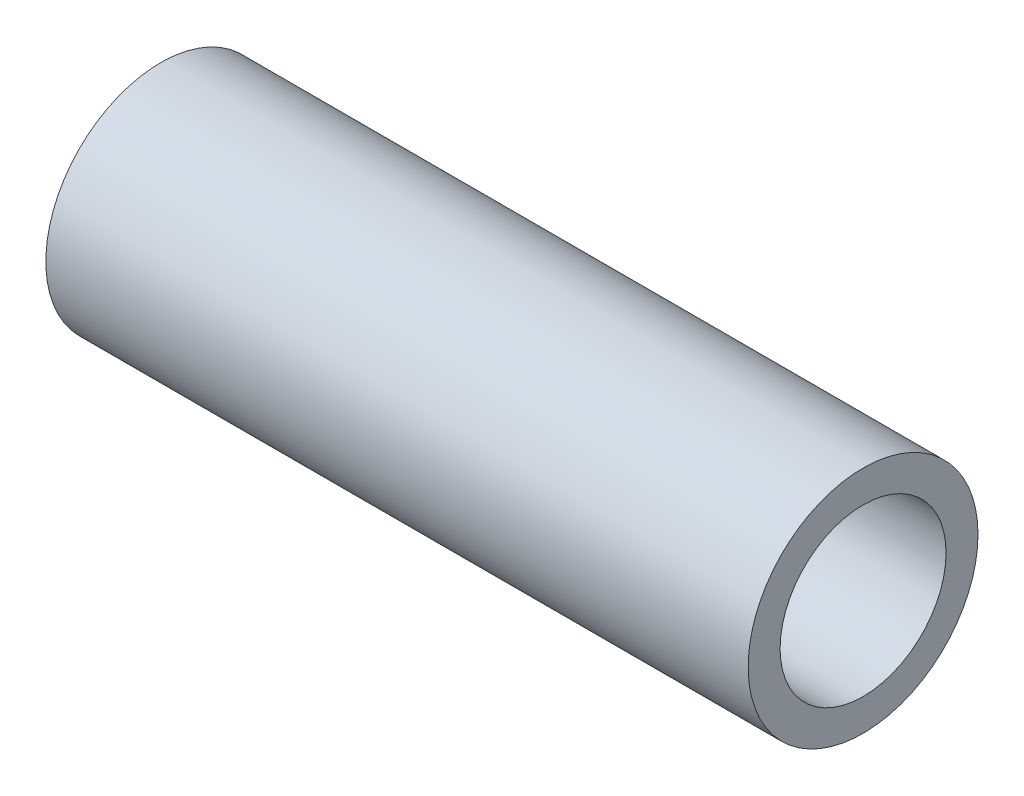
ISO-10303-21;
HEADER;
FILE_DESCRIPTION(('STEP AP214'),'2;1');
FILE_NAME('part.step','',(''),(''),'','','');
FILE_SCHEMA(('AUTOMOTIVE_DESIGN { 1 0 10303 214 1 1 1 1 }'));
ENDSEC;
DATA;
#1=APPLICATION_CONTEXT('core data for automotive mechanical design processes');
#2=APPLICATION_PROTOCOL_DEFINITION('international standard','automotive_design',2000,#1);
#3=PRODUCT_CONTEXT('',#1,'mechanical');
#4=PRODUCT('Part','Part','',(#3));
#5=PRODUCT_RELATED_PRODUCT_CATEGORY('part','',(#4));
#6=PRODUCT_DEFINITION_FORMATION('','',#4);
#7=PRODUCT_DEFINITION_CONTEXT('part definition',#1,'design');
#8=PRODUCT_DEFINITION('design','',#6,#7);
#9=PRODUCT_DEFINITION_SHAPE('','',#8);
#10=(LENGTH_UNIT() NAMED_UNIT(*) SI_UNIT(.MILLI.,.METRE.));
#11=(NAMED_UNIT(*) PLANE_ANGLE_UNIT() SI_UNIT($,.RADIAN.));
#12=(NAMED_UNIT(*) SI_UNIT($,.STERADIAN.) SOLID_ANGLE_UNIT());
#13=UNCERTAINTY_MEASURE_WITH_UNIT(LENGTH_MEASURE(1.E-05),#10,'distance_accuracy_value','');
#14=(GEOMETRIC_REPRESENTATION_CONTEXT(3) GLOBAL_UNCERTAINTY_ASSIGNED_CONTEXT((#13)) GLOBAL_UNIT_ASSIGNED_CONTEXT((#10,
#11,#12)) REPRESENTATION_CONTEXT('',''));
#15=CARTESIAN_POINT('',(0.,0.,0.));
#16=DIRECTION('',(0.,0.,1.));
#17=DIRECTION('',(1.,0.,0.));
#18=AXIS2_PLACEMENT_3D('',#15,#16,#17);
#19=CARTESIAN_POINT('',(27.5,0.,0.));
#20=DIRECTION('',(1.,0.,0.));
#21=DIRECTION('',(0.,0.,-1.));
#22=AXIS2_PLACEMENT_3D('',#19,#20,#21);
#23=PLANE('',#22);
#24=CARTESIAN_POINT('',(27.5,0.,0.));
#25=DIRECTION('',(1.,0.,0.));
#26=DIRECTION('',(0.,0.,-1.));
#27=AXIS2_PLACEMENT_3D('',#24,#25,#26);
#28=CIRCLE('',#27,9.);
#29=CARTESIAN_POINT('',(27.5,0.,-9.));
#30=VERTEX_POINT('',#29);
#31=EDGE_CURVE('E10',#30,#30,#28,.T.);
#32=ORIENTED_EDGE('',*,*,#31,.T.);
#33=EDGE_LOOP('',(#32));
#34=FACE_BOUND('',#33,.T.);
#35=CARTESIAN_POINT('',(27.5,0.,0.));
#36=DIRECTION('',(1.,0.,0.));
#37=DIRECTION('',(0.,0.,-1.));
#38=AXIS2_PLACEMENT_3D('',#35,#36,#37);
#39=CIRCLE('',#38,6.5);
#40=CARTESIAN_POINT('',(27.5,0.,-6.5));
#41=VERTEX_POINT('',#40);
#42=EDGE_CURVE('E48',#41,#41,#39,.T.);
#43=ORIENTED_EDGE('',*,*,#42,.F.);
#44=EDGE_LOOP('',(#43));
#45=FACE_BOUND('',#44,.T.);
#46=ADVANCED_FACE('F40',(#34,#45),#23,.T.);
#47=CARTESIAN_POINT('',(-27.5,0.,0.));
#48=DIRECTION('',(1.,0.,0.));
#49=DIRECTION('',(0.,0.,-1.));
#50=AXIS2_PLACEMENT_3D('',#47,#48,#49);
#51=PLANE('',#50);
#52=CARTESIAN_POINT('',(-27.5,0.,0.));
#53=DIRECTION('',(1.,0.,0.));
#54=DIRECTION('',(0.,0.,-1.));
#55=AXIS2_PLACEMENT_3D('',#52,#53,#54);
#56=CIRCLE('',#55,9.);
#57=CARTESIAN_POINT('',(-27.5,0.,-9.));
#58=VERTEX_POINT('',#57);
#59=EDGE_CURVE('E41',#58,#58,#56,.T.);
#60=ORIENTED_EDGE('',*,*,#59,.F.);
#61=EDGE_LOOP('',(#60));
#62=FACE_BOUND('',#61,.T.);
#63=CARTESIAN_POINT('',(-27.5,0.,0.));
#64=DIRECTION('',(1.,0.,0.));
#65=DIRECTION('',(0.,0.,-1.));
#66=AXIS2_PLACEMENT_3D('',#63,#64,#65);
#67=CIRCLE('',#66,6.5);
#68=CARTESIAN_POINT('',(-27.5,0.,-6.5));
#69=VERTEX_POINT('',#68);
#70=EDGE_CURVE('E49',#69,#69,#67,.T.);
#71=ORIENTED_EDGE('',*,*,#70,.T.);
#72=EDGE_LOOP('',(#71));
#73=FACE_BOUND('',#72,.T.);
#74=ADVANCED_FACE('F58',(#62,#73),#51,.F.);
#75=CARTESIAN_POINT('',(27.5,0.,0.));
#76=DIRECTION('',(-1.,0.,0.));
#77=DIRECTION('',(0.,0.,1.));
#78=AXIS2_PLACEMENT_3D('',#75,#76,#77);
#79=CYLINDRICAL_SURFACE('',#78,9.);
#80=ORIENTED_EDGE('',*,*,#31,.F.);
#81=EDGE_LOOP('',(#80));
#82=FACE_BOUND('',#81,.T.);
#83=ORIENTED_EDGE('',*,*,#59,.T.);
#84=EDGE_LOOP('',(#83));
#85=FACE_BOUND('',#84,.T.);
#86=ADVANCED_FACE('F39',(#82,#85),#79,.T.);
#87=CARTESIAN_POINT('',(27.5,0.,0.));
#88=DIRECTION('',(-1.,0.,0.));
#89=DIRECTION('',(0.,0.,1.));
#90=AXIS2_PLACEMENT_3D('',#87,#88,#89);
#91=CYLINDRICAL_SURFACE('',#90,6.5);
#92=ORIENTED_EDGE('',*,*,#42,.T.);
#93=EDGE_LOOP('',(#92));
#94=FACE_BOUND('',#93,.T.);
#95=ORIENTED_EDGE('',*,*,#70,.F.);
#96=EDGE_LOOP('',(#95));
#97=FACE_BOUND('',#96,.T.);
#98=ADVANCED_FACE('F57',(#94,#97),#91,.F.);
#99=CLOSED_SHELL('',(#46,#74,#86,#98));
#100=MANIFOLD_SOLID_BREP('B2',#99);
#101=ADVANCED_BREP_SHAPE_REPRESENTATION('',(#18,#100),#14);
#102=SHAPE_DEFINITION_REPRESENTATION(#9,#101);
ENDSEC;
END-ISO-10303-21;
